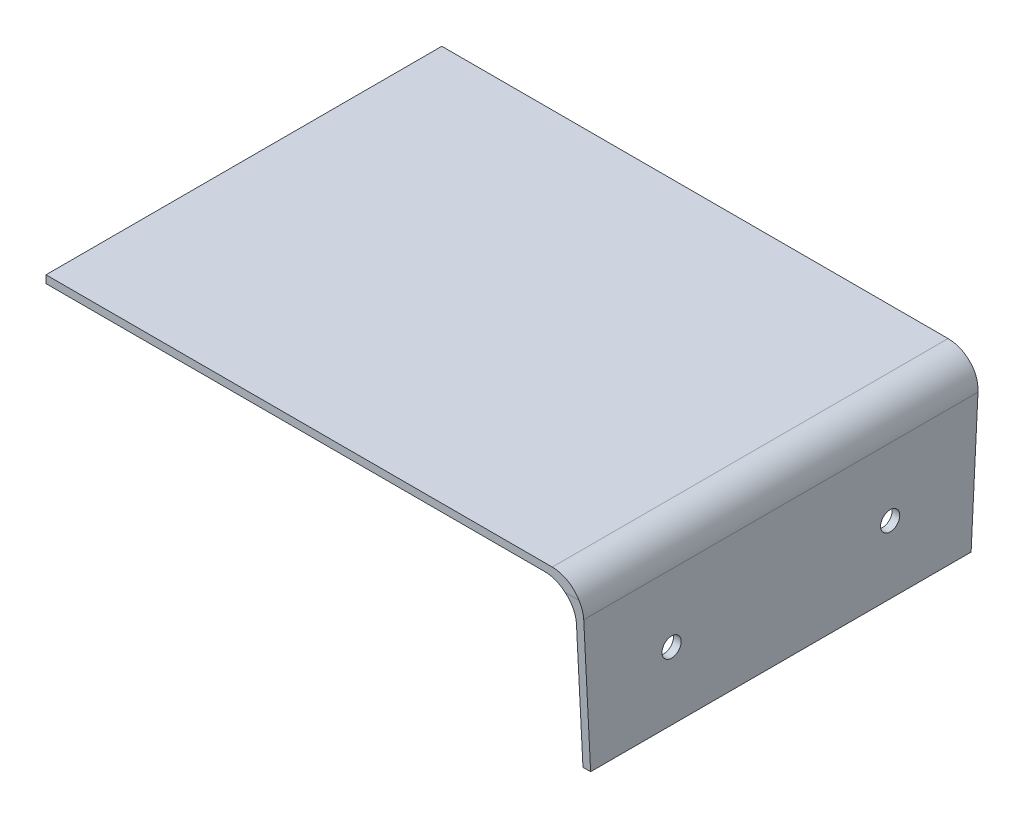
ISO-10303-21;
HEADER;
FILE_DESCRIPTION(('STEP AP214'),'2;1');
FILE_NAME('part.step','',(''),(''),'','','');
FILE_SCHEMA(('AUTOMOTIVE_DESIGN { 1 0 10303 214 1 1 1 1 }'));
ENDSEC;
DATA;
#1=APPLICATION_CONTEXT('core data for automotive mechanical design processes');
#2=APPLICATION_PROTOCOL_DEFINITION('international standard','automotive_design',2000,#1);
#3=PRODUCT_CONTEXT('',#1,'mechanical');
#4=PRODUCT('Part','Part','',(#3));
#5=PRODUCT_RELATED_PRODUCT_CATEGORY('part','',(#4));
#6=PRODUCT_DEFINITION_FORMATION('','',#4);
#7=PRODUCT_DEFINITION_CONTEXT('part definition',#1,'design');
#8=PRODUCT_DEFINITION('design','',#6,#7);
#9=PRODUCT_DEFINITION_SHAPE('','',#8);
#10=(LENGTH_UNIT() NAMED_UNIT(*) SI_UNIT(.MILLI.,.METRE.));
#11=(NAMED_UNIT(*) PLANE_ANGLE_UNIT() SI_UNIT($,.RADIAN.));
#12=(NAMED_UNIT(*) SI_UNIT($,.STERADIAN.) SOLID_ANGLE_UNIT());
#13=UNCERTAINTY_MEASURE_WITH_UNIT(LENGTH_MEASURE(1.E-05),#10,'distance_accuracy_value','');
#14=(GEOMETRIC_REPRESENTATION_CONTEXT(3) GLOBAL_UNCERTAINTY_ASSIGNED_CONTEXT((#13)) GLOBAL_UNIT_ASSIGNED_CONTEXT((#10,
#11,#12)) REPRESENTATION_CONTEXT('',''));
#15=CARTESIAN_POINT('',(0.,0.,0.));
#16=DIRECTION('',(0.,0.,1.));
#17=DIRECTION('',(1.,0.,0.));
#18=AXIS2_PLACEMENT_3D('',#15,#16,#17);
#19=CARTESIAN_POINT('',(-22.4970587455552,23.5,51.6));
#20=DIRECTION('',(1.,0.,0.));
#21=DIRECTION('',(0.,0.,-1.));
#22=AXIS2_PLACEMENT_3D('',#19,#20,#21);
#23=PLANE('',#22);
#24=DIRECTION('',(0.,0.,-1.));
#25=VECTOR('',#24,1.);
#26=CARTESIAN_POINT('',(-22.4970587455552,21.4986321651111,36.6));
#27=LINE('',#26,#25);
#28=CARTESIAN_POINT('',(-22.4970587455552,21.4986321651111,36.6));
#29=VERTEX_POINT('',#28);
#30=CARTESIAN_POINT('',(-22.4970587455552,21.4986321651111,15.));
#31=VERTEX_POINT('',#30);
#32=EDGE_CURVE('E47',#29,#31,#27,.T.);
#33=ORIENTED_EDGE('',*,*,#32,.F.);
#34=DIRECTION('',(0.,1.,0.));
#35=VECTOR('',#34,1.);
#36=CARTESIAN_POINT('',(-22.4970587455552,19.9986321651111,36.6));
#37=LINE('',#36,#35);
#38=CARTESIAN_POINT('',(-22.4970587455552,22.4986321651111,36.6));
#39=VERTEX_POINT('',#38);
#40=EDGE_CURVE('E174',#29,#39,#37,.T.);
#41=ORIENTED_EDGE('',*,*,#40,.T.);
#42=DIRECTION('',(0.,0.,-1.));
#43=VECTOR('',#42,1.);
#44=CARTESIAN_POINT('',(-22.4970587455552,22.4986321651111,51.6));
#45=LINE('',#44,#43);
#46=CARTESIAN_POINT('',(-22.4970587455552,22.4986321651111,51.6));
#47=VERTEX_POINT('',#46);
#48=EDGE_CURVE('E245',#47,#39,#45,.T.);
#49=ORIENTED_EDGE('',*,*,#48,.F.);
#50=DIRECTION('',(0.,-1.,0.));
#51=VECTOR('',#50,1.);
#52=CARTESIAN_POINT('',(-22.4970587455552,23.5,51.6));
#53=LINE('',#52,#51);
#54=CARTESIAN_POINT('',(-22.4970587455552,23.5,51.6));
#55=VERTEX_POINT('',#54);
#56=EDGE_CURVE('E223',#55,#47,#53,.T.);
#57=ORIENTED_EDGE('',*,*,#56,.F.);
#58=DIRECTION('',(0.,0.,-1.));
#59=VECTOR('',#58,1.);
#60=CARTESIAN_POINT('',(-22.4970587455552,23.5,51.6));
#61=LINE('',#60,#59);
#62=CARTESIAN_POINT('',(-22.4970587455552,23.5,0.));
#63=VERTEX_POINT('',#62);
#64=EDGE_CURVE('E248',#55,#63,#61,.T.);
#65=ORIENTED_EDGE('',*,*,#64,.T.);
#66=DIRECTION('',(0.,-1.,0.));
#67=VECTOR('',#66,1.);
#68=CARTESIAN_POINT('',(-22.4970587455552,23.5,0.));
#69=LINE('',#68,#67);
#70=CARTESIAN_POINT('',(-22.4970587455552,22.4986321651111,0.));
#71=VERTEX_POINT('',#70);
#72=EDGE_CURVE('E220',#63,#71,#69,.T.);
#73=ORIENTED_EDGE('',*,*,#72,.T.);
#74=CARTESIAN_POINT('',(-22.4970587455552,22.4986321651111,15.));
#75=VERTEX_POINT('',#74);
#76=EDGE_CURVE('E244',#75,#71,#45,.T.);
#77=ORIENTED_EDGE('',*,*,#76,.F.);
#78=DIRECTION('',(0.,1.,0.));
#79=VECTOR('',#78,1.);
#80=CARTESIAN_POINT('',(-22.4970587455552,19.9986321651111,15.));
#81=LINE('',#80,#79);
#82=EDGE_CURVE('E197',#31,#75,#81,.T.);
#83=ORIENTED_EDGE('',*,*,#82,.F.);
#84=EDGE_LOOP('',(#33,#41,#49,#57,#65,#73,#77,#83));
#85=FACE_BOUND('',#84,.T.);
#86=ADVANCED_FACE('F32',(#85),#23,.F.);
#87=CARTESIAN_POINT('',(42.6045983180506,22.4986321651111,51.6));
#88=DIRECTION('',(0.,1.,0.));
#89=DIRECTION('',(0.,0.,1.));
#90=AXIS2_PLACEMENT_3D('',#87,#88,#89);
#91=PLANE('',#90);
#92=DIRECTION('',(1.,0.,0.));
#93=VECTOR('',#92,1.);
#94=CARTESIAN_POINT('',(-22.4970587455552,22.4986321651111,15.));
#95=LINE('',#94,#93);
#96=CARTESIAN_POINT('',(-17.4970587455552,22.4986321651111,15.));
#97=VERTEX_POINT('',#96);
#98=EDGE_CURVE('E175',#75,#97,#95,.T.);
#99=ORIENTED_EDGE('',*,*,#98,.F.);
#100=ORIENTED_EDGE('',*,*,#76,.T.);
#101=DIRECTION('',(1.,0.,0.));
#102=VECTOR('',#101,1.);
#103=CARTESIAN_POINT('',(42.6045983180506,22.4986321651111,0.));
#104=LINE('',#103,#102);
#105=CARTESIAN_POINT('',(42.5029411784645,22.4986321651111,0.));
#106=VERTEX_POINT('',#105);
#107=EDGE_CURVE('E232',#71,#106,#104,.T.);
#108=ORIENTED_EDGE('',*,*,#107,.T.);
#109=DIRECTION('',(0.,0.,-1.));
#110=VECTOR('',#109,1.);
#111=CARTESIAN_POINT('',(42.5029411784645,22.4986321651111,51.6));
#112=LINE('',#111,#110);
#113=CARTESIAN_POINT('',(42.5029411784645,22.4986321651111,51.6));
#114=VERTEX_POINT('',#113);
#115=EDGE_CURVE('E258',#106,#114,#112,.F.);
#116=ORIENTED_EDGE('',*,*,#115,.T.);
#117=DIRECTION('',(1.,0.,0.));
#118=VECTOR('',#117,1.);
#119=CARTESIAN_POINT('',(42.6045983180506,22.4986321651111,51.6));
#120=LINE('',#119,#118);
#121=EDGE_CURVE('E226',#47,#114,#120,.T.);
#122=ORIENTED_EDGE('',*,*,#121,.F.);
#123=ORIENTED_EDGE('',*,*,#48,.T.);
#124=DIRECTION('',(-1.,0.,0.));
#125=VECTOR('',#124,1.);
#126=CARTESIAN_POINT('',(-22.4970587455552,22.4986321651111,36.6));
#127=LINE('',#126,#125);
#128=CARTESIAN_POINT('',(-17.4970587455552,22.4986321651111,36.6));
#129=VERTEX_POINT('',#128);
#130=EDGE_CURVE('E184',#129,#39,#127,.T.);
#131=ORIENTED_EDGE('',*,*,#130,.F.);
#132=DIRECTION('',(0.,0.,1.));
#133=VECTOR('',#132,1.);
#134=CARTESIAN_POINT('',(-17.4970587455552,22.4986321651111,15.));
#135=LINE('',#134,#133);
#136=EDGE_CURVE('E55',#97,#129,#135,.T.);
#137=ORIENTED_EDGE('',*,*,#136,.F.);
#138=EDGE_LOOP('',(#99,#100,#108,#116,#122,#123,#131,#137));
#139=FACE_BOUND('',#138,.T.);
#140=ADVANCED_FACE('F318',(#139),#91,.F.);
#141=CARTESIAN_POINT('',(46.5,22.4986321651111,51.6));
#142=DIRECTION('',(0.999999729472069,0.000735564945130568,0.));
#143=DIRECTION('',(-0.000735564945130568,0.999999729472069,0.));
#144=AXIS2_PLACEMENT_3D('',#141,#142,#143);
#145=PLANE('',#144);
#146=DIRECTION('',(-0.000734610106433536,0.998701627319374,0.050936430358112));
#147=VECTOR('',#146,1.);
#148=CARTESIAN_POINT('',(46.500001905828,22.4960411940484,51.650800741209));
#149=LINE('',#148,#147);
#150=CARTESIAN_POINT('',(46.5029412544448,18.5,51.4469920475803));
#151=VERTEX_POINT('',#150);
#152=CARTESIAN_POINT('',(46.5029400963527,18.5015744248916,51.4470723474233));
#153=VERTEX_POINT('',#152);
#154=EDGE_CURVE('E217',#151,#153,#149,.T.);
#155=ORIENTED_EDGE('',*,*,#154,.T.);
#156=DIRECTION('',(0.,0.,-1.));
#157=VECTOR('',#156,1.);
#158=CARTESIAN_POINT('',(46.5029400963527,18.5015744248916,0.));
#159=LINE('',#158,#157);
#160=CARTESIAN_POINT('',(46.5029400963527,18.5015744248916,0.152927652576708));
#161=VERTEX_POINT('',#160);
#162=EDGE_CURVE('E255',#153,#161,#159,.T.);
#163=ORIENTED_EDGE('',*,*,#162,.T.);
#164=DIRECTION('',(0.000734610106433536,-0.998701627319374,0.0509364303581119));
#165=VECTOR('',#164,1.);
#166=CARTESIAN_POINT('',(46.5019326961208,19.8711339262025,0.0830764875725462));
#167=LINE('',#166,#165);
#168=CARTESIAN_POINT('',(46.5029412544448,18.5,0.153007952419679));
#169=VERTEX_POINT('',#168);
#170=EDGE_CURVE('E207',#161,#169,#167,.T.);
#171=ORIENTED_EDGE('',*,*,#170,.T.);
#172=DIRECTION('',(0.,0.,-1.));
#173=VECTOR('',#172,1.);
#174=CARTESIAN_POINT('',(46.5029412544448,18.5,51.6));
#175=LINE('',#174,#173);
#176=EDGE_CURVE('E241',#151,#169,#175,.T.);
#177=ORIENTED_EDGE('',*,*,#176,.F.);
#178=EDGE_LOOP('',(#155,#163,#171,#177));
#179=FACE_BOUND('',#178,.T.);
#180=ADVANCED_FACE('F310',(#179),#145,.F.);
#181=CARTESIAN_POINT('',(46.5029412544448,18.5,51.6));
#182=DIRECTION('',(1.,0.,0.));
#183=DIRECTION('',(0.,0.,-1.));
#184=AXIS2_PLACEMENT_3D('',#181,#182,#183);
#185=PLANE('',#184);
#186=CARTESIAN_POINT('',(46.5029412544448,10.6965879793898,11.5510026508066));
#187=DIRECTION('',(1.,0.,0.));
#188=DIRECTION('',(0.,0.,-1.));
#189=AXIS2_PLACEMENT_3D('',#186,#187,#188);
#190=CIRCLE('',#189,1.25);
#191=CARTESIAN_POINT('',(46.5029412544448,10.6965879793898,10.3010026508066));
#192=VERTEX_POINT('',#191);
#193=EDGE_CURVE('E345',#192,#192,#190,.T.);
#194=ORIENTED_EDGE('',*,*,#193,.T.);
#195=EDGE_LOOP('',(#194));
#196=FACE_BOUND('',#195,.T.);
#197=CARTESIAN_POINT('',(46.5029412544448,10.6965879793898,40.0489973491934));
#198=DIRECTION('',(1.,0.,0.));
#199=DIRECTION('',(0.,0.,-1.));
#200=AXIS2_PLACEMENT_3D('',#197,#198,#199);
#201=CIRCLE('',#200,1.25);
#202=CARTESIAN_POINT('',(46.5029412544448,10.6965879793898,38.7989973491934));
#203=VERTEX_POINT('',#202);
#204=EDGE_CURVE('E338',#203,#203,#201,.T.);
#205=ORIENTED_EDGE('',*,*,#204,.T.);
#206=EDGE_LOOP('',(#205));
#207=FACE_BOUND('',#206,.T.);
#208=ORIENTED_EDGE('',*,*,#176,.T.);
#209=DIRECTION('',(0.,-0.998701896795152,0.0509364441020909));
#210=VECTOR('',#209,1.);
#211=CARTESIAN_POINT('',(46.5029412544448,15.8828748796302,0.286488271050975));
#212=LINE('',#211,#210);
#213=CARTESIAN_POINT('',(46.5029412544448,1.89317595877968,1.));
#214=VERTEX_POINT('',#213);
#215=EDGE_CURVE('E204',#169,#214,#212,.T.);
#216=ORIENTED_EDGE('',*,*,#215,.T.);
#217=DIRECTION('',(0.,0.,-1.));
#218=VECTOR('',#217,1.);
#219=CARTESIAN_POINT('',(46.5029412544448,1.89317595877968,51.6));
#220=LINE('',#219,#218);
#221=CARTESIAN_POINT('',(46.5029412544448,1.89317595877968,50.6));
#222=VERTEX_POINT('',#221);
#223=EDGE_CURVE('E238',#222,#214,#220,.T.);
#224=ORIENTED_EDGE('',*,*,#223,.F.);
#225=DIRECTION('',(0.,0.998701896795152,0.050936444102091));
#226=VECTOR('',#225,1.);
#227=CARTESIAN_POINT('',(46.5029412544448,18.5077835640133,51.4473890299777));
#228=LINE('',#227,#226);
#229=EDGE_CURVE('E214',#222,#151,#228,.T.);
#230=ORIENTED_EDGE('',*,*,#229,.T.);
#231=EDGE_LOOP('',(#208,#216,#224,#230));
#232=FACE_BOUND('',#231,.T.);
#233=ADVANCED_FACE('F306',(#196,#207,#232),#185,.F.);
#234=CARTESIAN_POINT('',(46.5029412544448,1.89317595877968,51.6));
#235=DIRECTION('',(0.,1.,0.));
#236=DIRECTION('',(0.,0.,1.));
#237=AXIS2_PLACEMENT_3D('',#234,#235,#236);
#238=PLANE('',#237);
#239=ORIENTED_EDGE('',*,*,#223,.T.);
#240=DIRECTION('',(1.,0.,0.));
#241=VECTOR('',#240,1.);
#242=CARTESIAN_POINT('',(37.5029412544448,1.89317595877968,1.));
#243=LINE('',#242,#241);
#244=CARTESIAN_POINT('',(47.5029412544448,1.89317595877968,1.));
#245=VERTEX_POINT('',#244);
#246=EDGE_CURVE('E201',#214,#245,#243,.T.);
#247=ORIENTED_EDGE('',*,*,#246,.T.);
#248=DIRECTION('',(0.,0.,-1.));
#249=VECTOR('',#248,1.);
#250=CARTESIAN_POINT('',(47.5029412544448,1.89317595877968,51.6));
#251=LINE('',#250,#249);
#252=CARTESIAN_POINT('',(47.5029412544448,1.89317595877968,50.6));
#253=VERTEX_POINT('',#252);
#254=EDGE_CURVE('E229',#253,#245,#251,.T.);
#255=ORIENTED_EDGE('',*,*,#254,.F.);
#256=DIRECTION('',(1.,0.,0.));
#257=VECTOR('',#256,1.);
#258=CARTESIAN_POINT('',(37.5029412544448,1.89317595877968,50.6));
#259=LINE('',#258,#257);
#260=EDGE_CURVE('E212',#222,#253,#259,.T.);
#261=ORIENTED_EDGE('',*,*,#260,.F.);
#262=EDGE_LOOP('',(#239,#247,#255,#261));
#263=FACE_BOUND('',#262,.T.);
#264=ADVANCED_FACE('F304',(#263),#238,.F.);
#265=CARTESIAN_POINT('',(47.5029412544448,18.5,51.6));
#266=DIRECTION('',(-1.,0.,0.));
#267=DIRECTION('',(0.,0.,1.));
#268=AXIS2_PLACEMENT_3D('',#265,#266,#267);
#269=PLANE('',#268);
#270=CARTESIAN_POINT('',(47.5029412544448,10.6965879793898,11.5510026508066));
#271=DIRECTION('',(1.,0.,0.));
#272=DIRECTION('',(0.,0.,-1.));
#273=AXIS2_PLACEMENT_3D('',#270,#271,#272);
#274=CIRCLE('',#273,1.25);
#275=CARTESIAN_POINT('',(47.5029412544448,10.6965879793898,10.3010026508066));
#276=VERTEX_POINT('',#275);
#277=EDGE_CURVE('E350',#276,#276,#274,.T.);
#278=ORIENTED_EDGE('',*,*,#277,.F.);
#279=EDGE_LOOP('',(#278));
#280=FACE_BOUND('',#279,.T.);
#281=CARTESIAN_POINT('',(47.5029412544448,10.6965879793898,40.0489973491934));
#282=DIRECTION('',(1.,0.,0.));
#283=DIRECTION('',(0.,0.,-1.));
#284=AXIS2_PLACEMENT_3D('',#281,#282,#283);
#285=CIRCLE('',#284,1.25);
#286=CARTESIAN_POINT('',(47.5029412544448,10.6965879793898,38.7989973491934));
#287=VERTEX_POINT('',#286);
#288=EDGE_CURVE('E340',#287,#287,#285,.T.);
#289=ORIENTED_EDGE('',*,*,#288,.F.);
#290=EDGE_LOOP('',(#289));
#291=FACE_BOUND('',#290,.T.);
#292=DIRECTION('',(0.,-0.998701896795152,0.050936444102091));
#293=VECTOR('',#292,1.);
#294=CARTESIAN_POINT('',(47.5029412544448,21.5,0.));
#295=LINE('',#294,#293);
#296=CARTESIAN_POINT('',(47.5029412544448,19.5,0.102005301613117));
#297=VERTEX_POINT('',#296);
#298=EDGE_CURVE('E199',#297,#245,#295,.T.);
#299=ORIENTED_EDGE('',*,*,#298,.F.);
#300=DIRECTION('',(0.,0.,-1.));
#301=VECTOR('',#300,1.);
#302=CARTESIAN_POINT('',(47.5029412544448,19.5,51.6));
#303=LINE('',#302,#301);
#304=CARTESIAN_POINT('',(47.5029412544448,19.5,51.4979946983869));
#305=VERTEX_POINT('',#304);
#306=EDGE_CURVE('E265',#297,#305,#303,.F.);
#307=ORIENTED_EDGE('',*,*,#306,.T.);
#308=DIRECTION('',(0.,0.998701896795152,0.050936444102091));
#309=VECTOR('',#308,1.);
#310=CARTESIAN_POINT('',(47.5029412544448,1.89317595877968,50.6));
#311=LINE('',#310,#309);
#312=EDGE_CURVE('E209',#253,#305,#311,.T.);
#313=ORIENTED_EDGE('',*,*,#312,.F.);
#314=ORIENTED_EDGE('',*,*,#254,.T.);
#315=EDGE_LOOP('',(#299,#307,#313,#314));
#316=FACE_BOUND('',#315,.T.);
#317=ADVANCED_FACE('F296',(#280,#291,#316),#269,.F.);
#318=CARTESIAN_POINT('',(47.5029412544448,23.5,51.6));
#319=DIRECTION('',(0.,-1.,0.));
#320=DIRECTION('',(0.,0.,-1.));
#321=AXIS2_PLACEMENT_3D('',#318,#319,#320);
#322=PLANE('',#321);
#323=DIRECTION('',(-1.,0.,0.));
#324=VECTOR('',#323,1.);
#325=CARTESIAN_POINT('',(-22.4970587455552,23.5,51.6));
#326=LINE('',#325,#324);
#327=CARTESIAN_POINT('',(43.5029412544448,23.5,51.6));
#328=VERTEX_POINT('',#327);
#329=EDGE_CURVE('E221',#328,#55,#326,.T.);
#330=ORIENTED_EDGE('',*,*,#329,.F.);
#331=DIRECTION('',(0.,0.,-1.));
#332=VECTOR('',#331,1.);
#333=CARTESIAN_POINT('',(43.5029412544448,23.5,51.6));
#334=LINE('',#333,#332);
#335=CARTESIAN_POINT('',(43.5029412544448,23.5,0.));
#336=VERTEX_POINT('',#335);
#337=EDGE_CURVE('E260',#328,#336,#334,.T.);
#338=ORIENTED_EDGE('',*,*,#337,.T.);
#339=DIRECTION('',(-1.,0.,0.));
#340=VECTOR('',#339,1.);
#341=CARTESIAN_POINT('',(47.5029412544448,23.5,0.));
#342=LINE('',#341,#340);
#343=EDGE_CURVE('E224',#336,#63,#342,.T.);
#344=ORIENTED_EDGE('',*,*,#343,.T.);
#345=ORIENTED_EDGE('',*,*,#64,.F.);
#346=EDGE_LOOP('',(#330,#338,#344,#345));
#347=FACE_BOUND('',#346,.T.);
#348=ADVANCED_FACE('F326',(#347),#322,.F.);
#349=CARTESIAN_POINT('',(0.,0.,51.6));
#350=DIRECTION('',(0.,0.,1.));
#351=DIRECTION('',(1.,0.,0.));
#352=AXIS2_PLACEMENT_3D('',#349,#350,#351);
#353=PLANE('',#352);
#354=DIRECTION('',(-1.,0.,0.));
#355=VECTOR('',#354,1.);
#356=CARTESIAN_POINT('',(0.,21.5,51.6));
#357=LINE('',#356,#355);
#358=CARTESIAN_POINT('',(46.9670428695826,21.5,51.6));
#359=VERTEX_POINT('',#358);
#360=CARTESIAN_POINT('',(45.147140701892,21.5,51.6));
#361=VERTEX_POINT('',#360);
#362=EDGE_CURVE('E251',#359,#361,#357,.T.);
#363=ORIENTED_EDGE('',*,*,#362,.F.);
#364=CARTESIAN_POINT('',(43.5029412544448,19.5,51.6));
#365=DIRECTION('',(0.,0.,1.));
#366=DIRECTION('',(1.,0.,0.));
#367=AXIS2_PLACEMENT_3D('',#364,#365,#366);
#368=CIRCLE('',#367,4.);
#369=EDGE_CURVE('E11',#359,#328,#368,.T.);
#370=ORIENTED_EDGE('',*,*,#369,.T.);
#371=ORIENTED_EDGE('',*,*,#329,.T.);
#372=ORIENTED_EDGE('',*,*,#56,.T.);
#373=ORIENTED_EDGE('',*,*,#121,.T.);
#374=CARTESIAN_POINT('',(42.5029411784645,18.4986321651111,51.6));
#375=DIRECTION('',(0.,0.,1.));
#376=DIRECTION('',(1.,0.,0.));
#377=AXIS2_PLACEMENT_3D('',#374,#375,#376);
#378=CIRCLE('',#377,4.);
#379=EDGE_CURVE('E274',#114,#361,#378,.F.);
#380=ORIENTED_EDGE('',*,*,#379,.T.);
#381=EDGE_LOOP('',(#363,#370,#371,#372,#373,#380));
#382=FACE_BOUND('',#381,.T.);
#383=ADVANCED_FACE('F328',(#382),#353,.T.);
#384=CARTESIAN_POINT('',(0.,0.,0.));
#385=DIRECTION('',(0.,0.,1.));
#386=DIRECTION('',(1.,0.,0.));
#387=AXIS2_PLACEMENT_3D('',#384,#385,#386);
#388=PLANE('',#387);
#389=ORIENTED_EDGE('',*,*,#343,.F.);
#390=CARTESIAN_POINT('',(43.5029412544448,19.5,0.));
#391=DIRECTION('',(0.,0.,1.));
#392=DIRECTION('',(1.,0.,0.));
#393=AXIS2_PLACEMENT_3D('',#390,#391,#392);
#394=CIRCLE('',#393,4.);
#395=CARTESIAN_POINT('',(46.9670428695826,21.5,0.));
#396=VERTEX_POINT('',#395);
#397=EDGE_CURVE('E40',#336,#396,#394,.F.);
#398=ORIENTED_EDGE('',*,*,#397,.T.);
#399=DIRECTION('',(-1.,0.,0.));
#400=VECTOR('',#399,1.);
#401=CARTESIAN_POINT('',(0.,21.5,0.));
#402=LINE('',#401,#400);
#403=CARTESIAN_POINT('',(45.147140701892,21.5,0.));
#404=VERTEX_POINT('',#403);
#405=EDGE_CURVE('E253',#396,#404,#402,.T.);
#406=ORIENTED_EDGE('',*,*,#405,.T.);
#407=CARTESIAN_POINT('',(42.5029411784645,18.4986321651111,0.));
#408=DIRECTION('',(0.,0.,1.));
#409=DIRECTION('',(1.,0.,0.));
#410=AXIS2_PLACEMENT_3D('',#407,#408,#409);
#411=CIRCLE('',#410,4.);
#412=EDGE_CURVE('E272',#404,#106,#411,.T.);
#413=ORIENTED_EDGE('',*,*,#412,.T.);
#414=ORIENTED_EDGE('',*,*,#107,.F.);
#415=ORIENTED_EDGE('',*,*,#72,.F.);
#416=EDGE_LOOP('',(#389,#398,#406,#413,#414,#415));
#417=FACE_BOUND('',#416,.T.);
#418=ADVANCED_FACE('F281',(#417),#388,.F.);
#419=CARTESIAN_POINT('',(37.5029412544448,1.89317595877968,50.6));
#420=DIRECTION('',(0.,0.050936444102091,-0.998701896795152));
#421=DIRECTION('',(0.,0.998701896795152,0.050936444102091));
#422=AXIS2_PLACEMENT_3D('',#419,#420,#421);
#423=PLANE('',#422);
#424=ORIENTED_EDGE('',*,*,#312,.T.);
#425=CARTESIAN_POINT('',(43.5029412544448,19.5,51.4979946983869));
#426=DIRECTION('',(0.,0.050936444102091,-0.998701896795152));
#427=DIRECTION('',(0.,-0.998701896795152,-0.050936444102091));
#428=AXIS2_PLACEMENT_3D('',#425,#426,#427);
#429=ELLIPSE('',#428,4.00519916186807,4.);
#430=EDGE_CURVE('E267',#305,#359,#429,.F.);
#431=ORIENTED_EDGE('',*,*,#430,.T.);
#432=ORIENTED_EDGE('',*,*,#362,.T.);
#433=CARTESIAN_POINT('',(42.5029411784645,18.4986321651111,51.4469222843751));
#434=DIRECTION('',(0.,0.050936444102091,-0.998701896795152));
#435=DIRECTION('',(0.,0.998701896795152,0.050936444102091));
#436=AXIS2_PLACEMENT_3D('',#433,#434,#435);
#437=ELLIPSE('',#436,4.00519916186807,4.);
#438=EDGE_CURVE('E277',#361,#153,#437,.T.);
#439=ORIENTED_EDGE('',*,*,#438,.T.);
#440=ORIENTED_EDGE('',*,*,#154,.F.);
#441=ORIENTED_EDGE('',*,*,#229,.F.);
#442=ORIENTED_EDGE('',*,*,#260,.T.);
#443=EDGE_LOOP('',(#424,#431,#432,#439,#440,#441,#442));
#444=FACE_BOUND('',#443,.T.);
#445=ADVANCED_FACE('F299',(#444),#423,.F.);
#446=CARTESIAN_POINT('',(37.5029412544448,21.5,0.));
#447=DIRECTION('',(0.,0.050936444102091,0.998701896795152));
#448=DIRECTION('',(0.,-0.998701896795152,0.050936444102091));
#449=AXIS2_PLACEMENT_3D('',#446,#447,#448);
#450=PLANE('',#449);
#451=ORIENTED_EDGE('',*,*,#405,.F.);
#452=CARTESIAN_POINT('',(43.5029412544448,19.5,0.102005301613112));
#453=DIRECTION('',(0.,0.050936444102091,0.998701896795152));
#454=DIRECTION('',(0.,0.998701896795152,-0.050936444102091));
#455=AXIS2_PLACEMENT_3D('',#452,#453,#454);
#456=ELLIPSE('',#455,4.00519916186807,4.);
#457=EDGE_CURVE('E263',#396,#297,#456,.F.);
#458=ORIENTED_EDGE('',*,*,#457,.T.);
#459=ORIENTED_EDGE('',*,*,#298,.T.);
#460=ORIENTED_EDGE('',*,*,#246,.F.);
#461=ORIENTED_EDGE('',*,*,#215,.F.);
#462=ORIENTED_EDGE('',*,*,#170,.F.);
#463=CARTESIAN_POINT('',(42.5029411784645,18.4986321651111,0.153077715624873));
#464=DIRECTION('',(0.,0.050936444102091,0.998701896795152));
#465=DIRECTION('',(0.,-0.998701896795152,0.050936444102091));
#466=AXIS2_PLACEMENT_3D('',#463,#464,#465);
#467=ELLIPSE('',#466,4.00519916186807,4.);
#468=EDGE_CURVE('E269',#161,#404,#467,.T.);
#469=ORIENTED_EDGE('',*,*,#468,.T.);
#470=EDGE_LOOP('',(#451,#458,#459,#460,#461,#462,#469));
#471=FACE_BOUND('',#470,.T.);
#472=ADVANCED_FACE('F287',(#471),#450,.F.);
#473=CARTESIAN_POINT('',(42.5029411784645,18.4986321651111,51.6));
#474=DIRECTION('',(0.,0.,1.));
#475=DIRECTION('',(1.,0.,0.));
#476=AXIS2_PLACEMENT_3D('',#473,#474,#475);
#477=CYLINDRICAL_SURFACE('',#476,4.);
#478=ORIENTED_EDGE('',*,*,#379,.F.);
#479=ORIENTED_EDGE('',*,*,#115,.F.);
#480=ORIENTED_EDGE('',*,*,#412,.F.);
#481=ORIENTED_EDGE('',*,*,#468,.F.);
#482=ORIENTED_EDGE('',*,*,#162,.F.);
#483=ORIENTED_EDGE('',*,*,#438,.F.);
#484=EDGE_LOOP('',(#478,#479,#480,#481,#482,#483));
#485=FACE_BOUND('',#484,.T.);
#486=ADVANCED_FACE('F315',(#485),#477,.F.);
#487=CARTESIAN_POINT('',(43.5029412544448,19.5,51.6));
#488=DIRECTION('',(0.,0.,-1.));
#489=DIRECTION('',(-1.,0.,0.));
#490=AXIS2_PLACEMENT_3D('',#487,#488,#489);
#491=CYLINDRICAL_SURFACE('',#490,4.);
#492=ORIENTED_EDGE('',*,*,#430,.F.);
#493=ORIENTED_EDGE('',*,*,#306,.F.);
#494=ORIENTED_EDGE('',*,*,#457,.F.);
#495=ORIENTED_EDGE('',*,*,#397,.F.);
#496=ORIENTED_EDGE('',*,*,#337,.F.);
#497=ORIENTED_EDGE('',*,*,#369,.F.);
#498=EDGE_LOOP('',(#492,#493,#494,#495,#496,#497));
#499=FACE_BOUND('',#498,.T.);
#500=ADVANCED_FACE('F34',(#499),#491,.T.);
#501=CARTESIAN_POINT('',(-22.4970587455552,19.9986321651111,15.));
#502=DIRECTION('',(0.,0.,1.));
#503=DIRECTION('',(1.,0.,0.));
#504=AXIS2_PLACEMENT_3D('',#501,#502,#503);
#505=PLANE('',#504);
#506=ORIENTED_EDGE('',*,*,#98,.T.);
#507=DIRECTION('',(0.,1.,0.));
#508=VECTOR('',#507,1.);
#509=CARTESIAN_POINT('',(-17.4970587455552,19.9986321651111,15.));
#510=LINE('',#509,#508);
#511=CARTESIAN_POINT('',(-17.4970587455552,19.9986321651111,15.));
#512=VERTEX_POINT('',#511);
#513=EDGE_CURVE('E194',#512,#97,#510,.T.);
#514=ORIENTED_EDGE('',*,*,#513,.F.);
#515=DIRECTION('',(1.,0.,0.));
#516=VECTOR('',#515,1.);
#517=CARTESIAN_POINT('',(-22.4970587455552,19.9986321651111,15.));
#518=LINE('',#517,#516);
#519=CARTESIAN_POINT('',(-24.4970587455552,19.9986321651111,15.));
#520=VERTEX_POINT('',#519);
#521=EDGE_CURVE('E181',#520,#512,#518,.T.);
#522=ORIENTED_EDGE('',*,*,#521,.F.);
#523=DIRECTION('',(0.,-1.,0.));
#524=VECTOR('',#523,1.);
#525=CARTESIAN_POINT('',(-24.4970587455552,19.9986321651111,15.));
#526=LINE('',#525,#524);
#527=CARTESIAN_POINT('',(-24.4970587455552,21.4986321651111,15.));
#528=VERTEX_POINT('',#527);
#529=EDGE_CURVE('E161',#528,#520,#526,.T.);
#530=ORIENTED_EDGE('',*,*,#529,.F.);
#531=DIRECTION('',(1.,0.,0.));
#532=VECTOR('',#531,1.);
#533=CARTESIAN_POINT('',(-24.4970587455552,21.4986321651111,15.));
#534=LINE('',#533,#532);
#535=EDGE_CURVE('E157',#528,#31,#534,.T.);
#536=ORIENTED_EDGE('',*,*,#535,.T.);
#537=ORIENTED_EDGE('',*,*,#82,.T.);
#538=EDGE_LOOP('',(#506,#514,#522,#530,#536,#537));
#539=FACE_BOUND('',#538,.T.);
#540=ADVANCED_FACE('F335',(#539),#505,.F.);
#541=CARTESIAN_POINT('',(-17.4970587455552,19.9986321651111,15.));
#542=DIRECTION('',(-1.,0.,0.));
#543=DIRECTION('',(0.,0.,1.));
#544=AXIS2_PLACEMENT_3D('',#541,#542,#543);
#545=PLANE('',#544);
#546=ORIENTED_EDGE('',*,*,#136,.T.);
#547=DIRECTION('',(0.,1.,0.));
#548=VECTOR('',#547,1.);
#549=CARTESIAN_POINT('',(-17.4970587455552,19.9986321651111,36.6));
#550=LINE('',#549,#548);
#551=CARTESIAN_POINT('',(-17.4970587455552,19.9986321651111,36.6));
#552=VERTEX_POINT('',#551);
#553=EDGE_CURVE('E191',#552,#129,#550,.T.);
#554=ORIENTED_EDGE('',*,*,#553,.F.);
#555=DIRECTION('',(0.,0.,1.));
#556=VECTOR('',#555,1.);
#557=CARTESIAN_POINT('',(-17.4970587455552,19.9986321651111,15.));
#558=LINE('',#557,#556);
#559=EDGE_CURVE('E183',#512,#552,#558,.T.);
#560=ORIENTED_EDGE('',*,*,#559,.F.);
#561=ORIENTED_EDGE('',*,*,#513,.T.);
#562=EDGE_LOOP('',(#546,#554,#560,#561));
#563=FACE_BOUND('',#562,.T.);
#564=ADVANCED_FACE('F332',(#563),#545,.F.);
#565=CARTESIAN_POINT('',(-22.4970587455552,19.9986321651111,36.6));
#566=DIRECTION('',(0.,0.,-1.));
#567=DIRECTION('',(-1.,0.,0.));
#568=AXIS2_PLACEMENT_3D('',#565,#566,#567);
#569=PLANE('',#568);
#570=ORIENTED_EDGE('',*,*,#130,.T.);
#571=ORIENTED_EDGE('',*,*,#40,.F.);
#572=DIRECTION('',(1.,0.,0.));
#573=VECTOR('',#572,1.);
#574=CARTESIAN_POINT('',(-24.4970587455552,21.4986321651111,36.6));
#575=LINE('',#574,#573);
#576=CARTESIAN_POINT('',(-24.4970587455552,21.4986321651111,36.6));
#577=VERTEX_POINT('',#576);
#578=EDGE_CURVE('E155',#577,#29,#575,.T.);
#579=ORIENTED_EDGE('',*,*,#578,.F.);
#580=DIRECTION('',(0.,1.,0.));
#581=VECTOR('',#580,1.);
#582=CARTESIAN_POINT('',(-24.4970587455552,19.9986321651111,36.6));
#583=LINE('',#582,#581);
#584=CARTESIAN_POINT('',(-24.4970587455552,19.9986321651111,36.6));
#585=VERTEX_POINT('',#584);
#586=EDGE_CURVE('E162',#585,#577,#583,.T.);
#587=ORIENTED_EDGE('',*,*,#586,.F.);
#588=DIRECTION('',(-1.,0.,0.));
#589=VECTOR('',#588,1.);
#590=CARTESIAN_POINT('',(-22.4970587455552,19.9986321651111,36.6));
#591=LINE('',#590,#589);
#592=EDGE_CURVE('E186',#552,#585,#591,.T.);
#593=ORIENTED_EDGE('',*,*,#592,.F.);
#594=ORIENTED_EDGE('',*,*,#553,.T.);
#595=EDGE_LOOP('',(#570,#571,#579,#587,#593,#594));
#596=FACE_BOUND('',#595,.T.);
#597=ADVANCED_FACE('F173',(#596),#569,.F.);
#598=CARTESIAN_POINT('',(0.,19.9986321651111,0.));
#599=DIRECTION('',(0.,1.,0.));
#600=DIRECTION('',(0.,0.,1.));
#601=AXIS2_PLACEMENT_3D('',#598,#599,#600);
#602=PLANE('',#601);
#603=ORIENTED_EDGE('',*,*,#592,.T.);
#604=DIRECTION('',(0.,0.,1.));
#605=VECTOR('',#604,1.);
#606=CARTESIAN_POINT('',(-24.4970587455552,19.9986321651111,36.6));
#607=LINE('',#606,#605);
#608=EDGE_CURVE('E168',#520,#585,#607,.T.);
#609=ORIENTED_EDGE('',*,*,#608,.F.);
#610=ORIENTED_EDGE('',*,*,#521,.T.);
#611=ORIENTED_EDGE('',*,*,#559,.T.);
#612=EDGE_LOOP('',(#603,#609,#610,#611));
#613=FACE_BOUND('',#612,.T.);
#614=ADVANCED_FACE('F485',(#613),#602,.F.);
#615=CARTESIAN_POINT('',(-24.4970587455552,21.4986321651111,36.6));
#616=DIRECTION('',(0.,-1.,0.));
#617=DIRECTION('',(0.,0.,-1.));
#618=AXIS2_PLACEMENT_3D('',#615,#616,#617);
#619=PLANE('',#618);
#620=ORIENTED_EDGE('',*,*,#32,.T.);
#621=ORIENTED_EDGE('',*,*,#535,.F.);
#622=DIRECTION('',(0.,0.,-1.));
#623=VECTOR('',#622,1.);
#624=CARTESIAN_POINT('',(-24.4970587455552,21.4986321651111,36.6));
#625=LINE('',#624,#623);
#626=EDGE_CURVE('E151',#577,#528,#625,.T.);
#627=ORIENTED_EDGE('',*,*,#626,.F.);
#628=ORIENTED_EDGE('',*,*,#578,.T.);
#629=EDGE_LOOP('',(#620,#621,#627,#628));
#630=FACE_BOUND('',#629,.T.);
#631=ADVANCED_FACE('F153',(#630),#619,.F.);
#632=CARTESIAN_POINT('',(-24.4970587455552,0.,0.));
#633=DIRECTION('',(-1.,0.,0.));
#634=DIRECTION('',(0.,0.,1.));
#635=AXIS2_PLACEMENT_3D('',#632,#633,#634);
#636=PLANE('',#635);
#637=ORIENTED_EDGE('',*,*,#586,.T.);
#638=ORIENTED_EDGE('',*,*,#626,.T.);
#639=ORIENTED_EDGE('',*,*,#529,.T.);
#640=ORIENTED_EDGE('',*,*,#608,.T.);
#641=EDGE_LOOP('',(#637,#638,#639,#640));
#642=FACE_BOUND('',#641,.T.);
#643=ADVANCED_FACE('F166',(#642),#636,.T.);
#644=CARTESIAN_POINT('',(45.5029412544448,10.6965879793898,40.0489973491934));
#645=DIRECTION('',(1.,0.,0.));
#646=DIRECTION('',(0.,0.,-1.));
#647=AXIS2_PLACEMENT_3D('',#644,#645,#646);
#648=CYLINDRICAL_SURFACE('',#647,1.25);
#649=ORIENTED_EDGE('',*,*,#288,.T.);
#650=EDGE_LOOP('',(#649));
#651=FACE_BOUND('',#650,.T.);
#652=ORIENTED_EDGE('',*,*,#204,.F.);
#653=EDGE_LOOP('',(#652));
#654=FACE_BOUND('',#653,.T.);
#655=ADVANCED_FACE('F362',(#651,#654),#648,.F.);
#656=CARTESIAN_POINT('',(45.5029412544448,10.6965879793898,11.5510026508066));
#657=DIRECTION('',(1.,0.,0.));
#658=DIRECTION('',(0.,0.,-1.));
#659=AXIS2_PLACEMENT_3D('',#656,#657,#658);
#660=CYLINDRICAL_SURFACE('',#659,1.25);
#661=ORIENTED_EDGE('',*,*,#277,.T.);
#662=EDGE_LOOP('',(#661));
#663=FACE_BOUND('',#662,.T.);
#664=ORIENTED_EDGE('',*,*,#193,.F.);
#665=EDGE_LOOP('',(#664));
#666=FACE_BOUND('',#665,.T.);
#667=ADVANCED_FACE('F354',(#663,#666),#660,.F.);
#668=CLOSED_SHELL('',(#86,#140,#180,#233,#264,#317,#348,#383,#418,#445,#472,#486,#500,#540,#564,
#597,#614,#631,#643,#655,#667));
#669=MANIFOLD_SOLID_BREP('B2',#668);
#670=ADVANCED_BREP_SHAPE_REPRESENTATION('',(#18,#669),#14);
#671=SHAPE_DEFINITION_REPRESENTATION(#9,#670);
ENDSEC;
END-ISO-10303-21;
